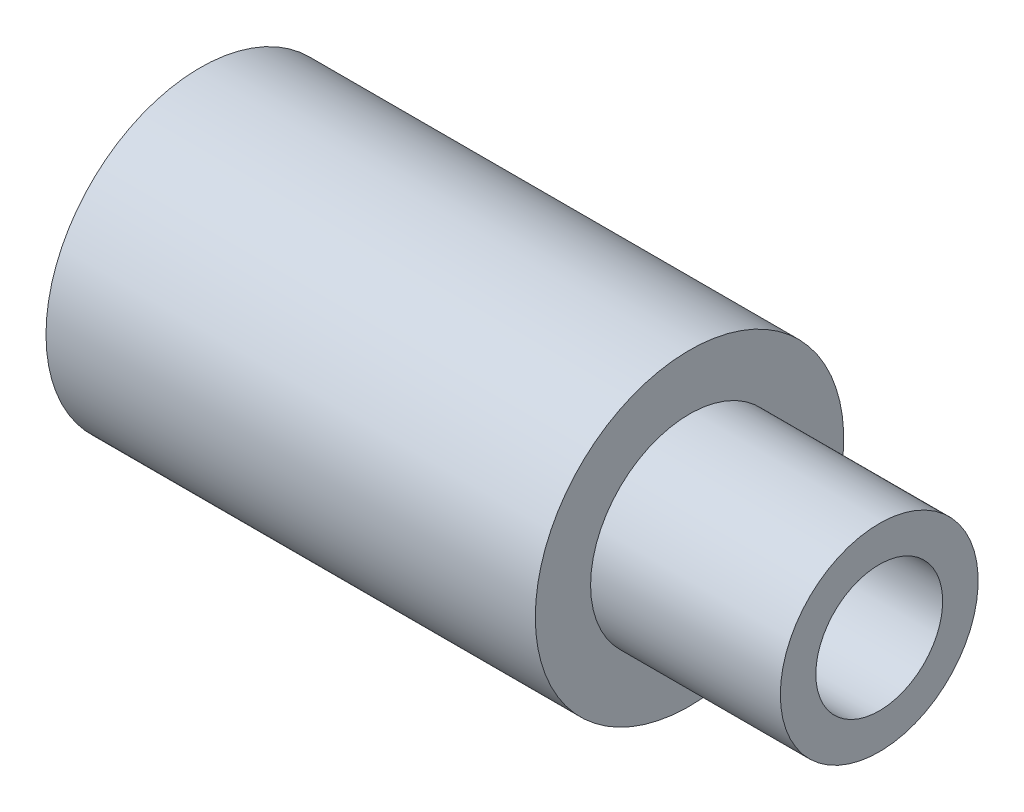
ISO-10303-21;
HEADER;
FILE_DESCRIPTION(('STEP AP214'),'2;1');
FILE_NAME('part.step','',(''),(''),'','','');
FILE_SCHEMA(('AUTOMOTIVE_DESIGN { 1 0 10303 214 1 1 1 1 }'));
ENDSEC;
DATA;
#1=APPLICATION_CONTEXT('core data for automotive mechanical design processes');
#2=APPLICATION_PROTOCOL_DEFINITION('international standard','automotive_design',2000,#1);
#3=PRODUCT_CONTEXT('',#1,'mechanical');
#4=PRODUCT('Part','Part','',(#3));
#5=PRODUCT_RELATED_PRODUCT_CATEGORY('part','',(#4));
#6=PRODUCT_DEFINITION_FORMATION('','',#4);
#7=PRODUCT_DEFINITION_CONTEXT('part definition',#1,'design');
#8=PRODUCT_DEFINITION('design','',#6,#7);
#9=PRODUCT_DEFINITION_SHAPE('','',#8);
#10=(LENGTH_UNIT() NAMED_UNIT(*) SI_UNIT(.MILLI.,.METRE.));
#11=(NAMED_UNIT(*) PLANE_ANGLE_UNIT() SI_UNIT($,.RADIAN.));
#12=(NAMED_UNIT(*) SI_UNIT($,.STERADIAN.) SOLID_ANGLE_UNIT());
#13=UNCERTAINTY_MEASURE_WITH_UNIT(LENGTH_MEASURE(1.E-05),#10,'distance_accuracy_value','');
#14=(GEOMETRIC_REPRESENTATION_CONTEXT(3) GLOBAL_UNCERTAINTY_ASSIGNED_CONTEXT((#13)) GLOBAL_UNIT_ASSIGNED_CONTEXT((#10,
#11,#12)) REPRESENTATION_CONTEXT('',''));
#15=CARTESIAN_POINT('',(0.,0.,0.));
#16=DIRECTION('',(0.,0.,1.));
#17=DIRECTION('',(1.,0.,0.));
#18=AXIS2_PLACEMENT_3D('',#15,#16,#17);
#19=CARTESIAN_POINT('',(9.5,0.,0.));
#20=DIRECTION('',(-1.,0.,0.));
#21=DIRECTION('',(0.,0.,1.));
#22=AXIS2_PLACEMENT_3D('',#19,#20,#21);
#23=PLANE('',#22);
#24=CARTESIAN_POINT('',(9.50000000000006,0.,0.));
#25=DIRECTION('',(-1.,0.,0.));
#26=DIRECTION('',(0.,0.,1.));
#27=AXIS2_PLACEMENT_3D('',#24,#25,#26);
#28=CIRCLE('',#27,3.175);
#29=CARTESIAN_POINT('',(9.50000000000006,0.,3.175));
#30=VERTEX_POINT('',#29);
#31=EDGE_CURVE('E59',#30,#30,#28,.F.);
#32=ORIENTED_EDGE('',*,*,#31,.F.);
#33=EDGE_LOOP('',(#32));
#34=FACE_BOUND('',#33,.T.);
#35=CARTESIAN_POINT('',(9.50000000000006,0.,0.));
#36=DIRECTION('',(-1.,0.,0.));
#37=DIRECTION('',(0.,0.,1.));
#38=AXIS2_PLACEMENT_3D('',#35,#36,#37);
#39=CIRCLE('',#38,4.953);
#40=CARTESIAN_POINT('',(9.50000000000006,0.,4.953));
#41=VERTEX_POINT('',#40);
#42=EDGE_CURVE('E10',#41,#41,#39,.T.);
#43=ORIENTED_EDGE('',*,*,#42,.F.);
#44=EDGE_LOOP('',(#43));
#45=FACE_BOUND('',#44,.T.);
#46=ADVANCED_FACE('F39',(#34,#45),#23,.F.);
#47=CARTESIAN_POINT('',(-1000.,0.,0.));
#48=DIRECTION('',(-1.,0.,0.));
#49=DIRECTION('',(0.,0.,1.));
#50=AXIS2_PLACEMENT_3D('',#47,#48,#49);
#51=CYLINDRICAL_SURFACE('',#50,4.953);
#52=CARTESIAN_POINT('',(0.,0.,0.));
#53=DIRECTION('',(-1.,0.,0.));
#54=DIRECTION('',(0.,0.,1.));
#55=AXIS2_PLACEMENT_3D('',#52,#53,#54);
#56=CIRCLE('',#55,4.953);
#57=CARTESIAN_POINT('',(0.,0.,4.953));
#58=VERTEX_POINT('',#57);
#59=EDGE_CURVE('E46',#58,#58,#56,.T.);
#60=ORIENTED_EDGE('',*,*,#59,.F.);
#61=EDGE_LOOP('',(#60));
#62=FACE_BOUND('',#61,.T.);
#63=ORIENTED_EDGE('',*,*,#42,.T.);
#64=EDGE_LOOP('',(#63));
#65=FACE_BOUND('',#64,.T.);
#66=ADVANCED_FACE('F84',(#62,#65),#51,.T.);
#67=CARTESIAN_POINT('',(0.,4.953,0.));
#68=DIRECTION('',(-1.,0.,0.));
#69=DIRECTION('',(0.,0.,1.));
#70=AXIS2_PLACEMENT_3D('',#67,#68,#69);
#71=PLANE('',#70);
#72=CARTESIAN_POINT('',(0.,0.,0.));
#73=DIRECTION('',(-1.,0.,0.));
#74=DIRECTION('',(0.,0.,1.));
#75=AXIS2_PLACEMENT_3D('',#72,#73,#74);
#76=CIRCLE('',#75,7.722);
#77=CARTESIAN_POINT('',(0.,0.,7.722));
#78=VERTEX_POINT('',#77);
#79=EDGE_CURVE('E49',#78,#78,#76,.T.);
#80=ORIENTED_EDGE('',*,*,#79,.F.);
#81=EDGE_LOOP('',(#80));
#82=FACE_BOUND('',#81,.T.);
#83=ORIENTED_EDGE('',*,*,#59,.T.);
#84=EDGE_LOOP('',(#83));
#85=FACE_BOUND('',#84,.T.);
#86=ADVANCED_FACE('F79',(#82,#85),#71,.F.);
#87=CARTESIAN_POINT('',(-1000.,0.,0.));
#88=DIRECTION('',(-1.,0.,0.));
#89=DIRECTION('',(0.,0.,1.));
#90=AXIS2_PLACEMENT_3D('',#87,#88,#89);
#91=CYLINDRICAL_SURFACE('',#90,7.722);
#92=CARTESIAN_POINT('',(-24.5,0.,0.));
#93=DIRECTION('',(-1.,0.,0.));
#94=DIRECTION('',(0.,0.,1.));
#95=AXIS2_PLACEMENT_3D('',#92,#93,#94);
#96=CIRCLE('',#95,7.722);
#97=CARTESIAN_POINT('',(-24.5,0.,7.722));
#98=VERTEX_POINT('',#97);
#99=EDGE_CURVE('E54',#98,#98,#96,.T.);
#100=ORIENTED_EDGE('',*,*,#99,.F.);
#101=EDGE_LOOP('',(#100));
#102=FACE_BOUND('',#101,.T.);
#103=ORIENTED_EDGE('',*,*,#79,.T.);
#104=EDGE_LOOP('',(#103));
#105=FACE_BOUND('',#104,.T.);
#106=ADVANCED_FACE('F68',(#102,#105),#91,.T.);
#107=CARTESIAN_POINT('',(-24.5,7.722,0.));
#108=DIRECTION('',(1.,0.,0.));
#109=DIRECTION('',(0.,0.,-1.));
#110=AXIS2_PLACEMENT_3D('',#107,#108,#109);
#111=PLANE('',#110);
#112=CARTESIAN_POINT('',(-24.5,0.,0.));
#113=DIRECTION('',(1.,0.,0.));
#114=DIRECTION('',(0.,0.,-1.));
#115=AXIS2_PLACEMENT_3D('',#112,#113,#114);
#116=CIRCLE('',#115,3.175);
#117=CARTESIAN_POINT('',(-24.5,0.,-3.175));
#118=VERTEX_POINT('',#117);
#119=EDGE_CURVE('E45',#118,#118,#116,.F.);
#120=ORIENTED_EDGE('',*,*,#119,.F.);
#121=EDGE_LOOP('',(#120));
#122=FACE_BOUND('',#121,.T.);
#123=ORIENTED_EDGE('',*,*,#99,.T.);
#124=EDGE_LOOP('',(#123));
#125=FACE_BOUND('',#124,.T.);
#126=ADVANCED_FACE('F69',(#122,#125),#111,.F.);
#127=CARTESIAN_POINT('',(-1000.,0.,0.));
#128=DIRECTION('',(-1.,0.,0.));
#129=DIRECTION('',(0.,0.,1.));
#130=AXIS2_PLACEMENT_3D('',#127,#128,#129);
#131=CYLINDRICAL_SURFACE('',#130,3.175);
#132=ORIENTED_EDGE('',*,*,#119,.T.);
#133=EDGE_LOOP('',(#132));
#134=FACE_BOUND('',#133,.T.);
#135=ORIENTED_EDGE('',*,*,#31,.T.);
#136=EDGE_LOOP('',(#135));
#137=FACE_BOUND('',#136,.T.);
#138=ADVANCED_FACE('F62',(#134,#137),#131,.F.);
#139=CLOSED_SHELL('',(#46,#66,#86,#106,#126,#138));
#140=MANIFOLD_SOLID_BREP('B2',#139);
#141=ADVANCED_BREP_SHAPE_REPRESENTATION('',(#18,#140),#14);
#142=SHAPE_DEFINITION_REPRESENTATION(#9,#141);
ENDSEC;
END-ISO-10303-21;
